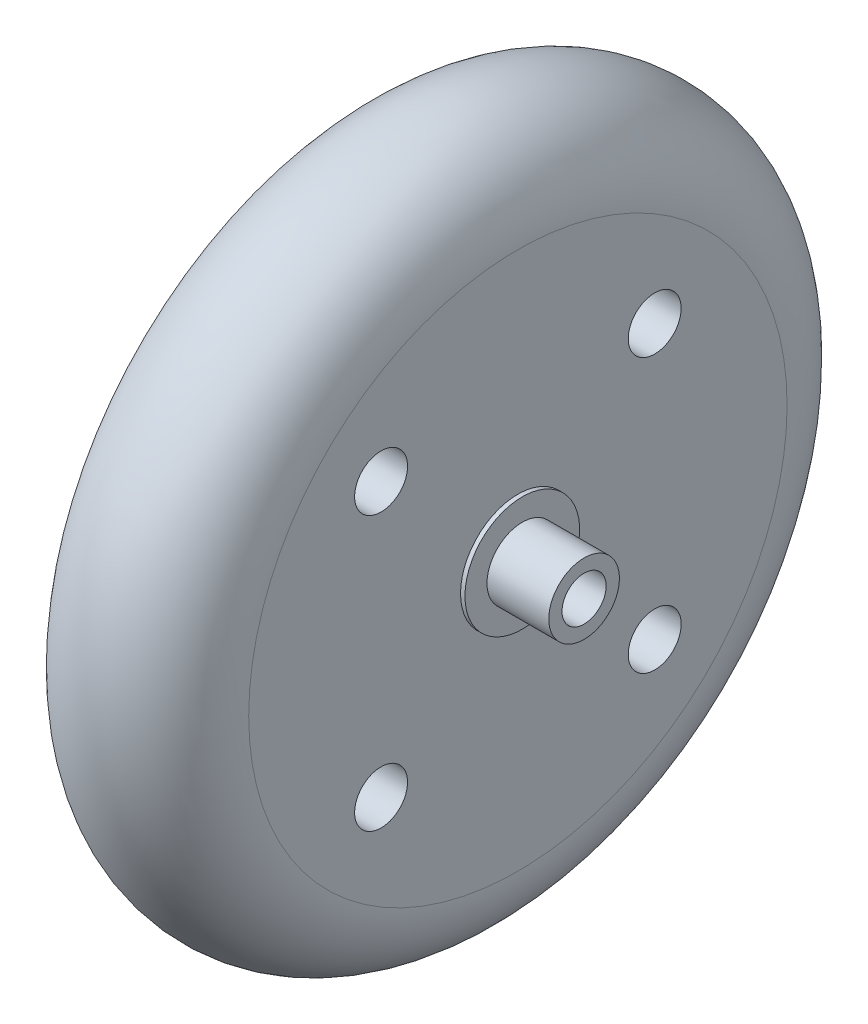
ISO-10303-21;
HEADER;
FILE_DESCRIPTION(('STEP AP214'),'2;1');
FILE_NAME('part.step','',(''),(''),'','','');
FILE_SCHEMA(('AUTOMOTIVE_DESIGN { 1 0 10303 214 1 1 1 1 }'));
ENDSEC;
DATA;
#1=APPLICATION_CONTEXT('core data for automotive mechanical design processes');
#2=APPLICATION_PROTOCOL_DEFINITION('international standard','automotive_design',2000,#1);
#3=PRODUCT_CONTEXT('',#1,'mechanical');
#4=PRODUCT('Part','Part','',(#3));
#5=PRODUCT_RELATED_PRODUCT_CATEGORY('part','',(#4));
#6=PRODUCT_DEFINITION_FORMATION('','',#4);
#7=PRODUCT_DEFINITION_CONTEXT('part definition',#1,'design');
#8=PRODUCT_DEFINITION('design','',#6,#7);
#9=PRODUCT_DEFINITION_SHAPE('','',#8);
#10=(LENGTH_UNIT() NAMED_UNIT(*) SI_UNIT(.MILLI.,.METRE.));
#11=(NAMED_UNIT(*) PLANE_ANGLE_UNIT() SI_UNIT($,.RADIAN.));
#12=(NAMED_UNIT(*) SI_UNIT($,.STERADIAN.) SOLID_ANGLE_UNIT());
#13=UNCERTAINTY_MEASURE_WITH_UNIT(LENGTH_MEASURE(1.E-05),#10,'distance_accuracy_value','');
#14=(GEOMETRIC_REPRESENTATION_CONTEXT(3) GLOBAL_UNCERTAINTY_ASSIGNED_CONTEXT((#13)) GLOBAL_UNIT_ASSIGNED_CONTEXT((#10,
#11,#12)) REPRESENTATION_CONTEXT('',''));
#15=CARTESIAN_POINT('',(0.,0.,0.));
#16=DIRECTION('',(0.,0.,1.));
#17=DIRECTION('',(1.,0.,0.));
#18=AXIS2_PLACEMENT_3D('',#15,#16,#17);
#19=CARTESIAN_POINT('',(10.,0.,0.));
#20=DIRECTION('',(-1.,0.,0.));
#21=DIRECTION('',(0.,0.,1.));
#22=AXIS2_PLACEMENT_3D('',#19,#20,#21);
#23=TOROIDAL_SURFACE('',#22,30.5,9.5);
#24=CARTESIAN_POINT('',(0.5,0.,0.));
#25=DIRECTION('',(-1.,0.,0.));
#26=DIRECTION('',(0.,0.,1.));
#27=AXIS2_PLACEMENT_3D('',#24,#25,#26);
#28=CIRCLE('',#27,30.5);
#29=CARTESIAN_POINT('',(0.5,0.,30.5));
#30=VERTEX_POINT('',#29);
#31=EDGE_CURVE('E10',#30,#30,#28,.T.);
#32=ORIENTED_EDGE('',*,*,#31,.F.);
#33=EDGE_LOOP('',(#32));
#34=FACE_BOUND('',#33,.T.);
#35=CARTESIAN_POINT('',(19.5,0.,0.));
#36=DIRECTION('',(-1.,0.,0.));
#37=DIRECTION('',(0.,0.,1.));
#38=AXIS2_PLACEMENT_3D('',#35,#36,#37);
#39=CIRCLE('',#38,30.5);
#40=CARTESIAN_POINT('',(19.5,0.,30.5));
#41=VERTEX_POINT('',#40);
#42=EDGE_CURVE('E72',#41,#41,#39,.T.);
#43=ORIENTED_EDGE('',*,*,#42,.T.);
#44=EDGE_LOOP('',(#43));
#45=FACE_BOUND('',#44,.T.);
#46=ADVANCED_FACE('F37',(#34,#45),#23,.T.);
#47=CARTESIAN_POINT('',(0.500000000000004,30.5,0.));
#48=DIRECTION('',(1.,0.,0.));
#49=DIRECTION('',(0.,0.,-1.));
#50=AXIS2_PLACEMENT_3D('',#47,#48,#49);
#51=PLANE('',#50);
#52=CARTESIAN_POINT('',(0.5,-15.5,15.5));
#53=DIRECTION('',(1.,0.,0.));
#54=DIRECTION('',(0.,0.,-1.));
#55=AXIS2_PLACEMENT_3D('',#52,#53,#54);
#56=CIRCLE('',#55,3.);
#57=CARTESIAN_POINT('',(0.5,-15.5,12.5));
#58=VERTEX_POINT('',#57);
#59=EDGE_CURVE('E89',#58,#58,#56,.T.);
#60=ORIENTED_EDGE('',*,*,#59,.T.);
#61=EDGE_LOOP('',(#60));
#62=FACE_BOUND('',#61,.T.);
#63=CARTESIAN_POINT('',(0.5,-15.5,-15.5));
#64=DIRECTION('',(1.,0.,0.));
#65=DIRECTION('',(0.,0.,-1.));
#66=AXIS2_PLACEMENT_3D('',#63,#64,#65);
#67=CIRCLE('',#66,3.);
#68=CARTESIAN_POINT('',(0.5,-15.5,-18.5));
#69=VERTEX_POINT('',#68);
#70=EDGE_CURVE('E97',#69,#69,#67,.T.);
#71=ORIENTED_EDGE('',*,*,#70,.T.);
#72=EDGE_LOOP('',(#71));
#73=FACE_BOUND('',#72,.T.);
#74=CARTESIAN_POINT('',(0.5,15.5,-15.5));
#75=DIRECTION('',(1.,0.,0.));
#76=DIRECTION('',(0.,0.,-1.));
#77=AXIS2_PLACEMENT_3D('',#74,#75,#76);
#78=CIRCLE('',#77,3.);
#79=CARTESIAN_POINT('',(0.5,15.5,-18.5));
#80=VERTEX_POINT('',#79);
#81=EDGE_CURVE('E81',#80,#80,#78,.T.);
#82=ORIENTED_EDGE('',*,*,#81,.T.);
#83=EDGE_LOOP('',(#82));
#84=FACE_BOUND('',#83,.T.);
#85=CARTESIAN_POINT('',(0.5,15.5,15.5));
#86=DIRECTION('',(1.,0.,0.));
#87=DIRECTION('',(0.,0.,-1.));
#88=AXIS2_PLACEMENT_3D('',#85,#86,#87);
#89=CIRCLE('',#88,3.);
#90=CARTESIAN_POINT('',(0.5,15.5,12.5));
#91=VERTEX_POINT('',#90);
#92=EDGE_CURVE('E76',#91,#91,#89,.T.);
#93=ORIENTED_EDGE('',*,*,#92,.T.);
#94=EDGE_LOOP('',(#93));
#95=FACE_BOUND('',#94,.T.);
#96=CARTESIAN_POINT('',(0.500000000000007,0.,0.));
#97=DIRECTION('',(-1.,0.,0.));
#98=DIRECTION('',(0.,0.,1.));
#99=AXIS2_PLACEMENT_3D('',#96,#97,#98);
#100=CIRCLE('',#99,2.50000000002728);
#101=CARTESIAN_POINT('',(0.500000000000007,0.,2.50000000002728));
#102=VERTEX_POINT('',#101);
#103=EDGE_CURVE('E44',#102,#102,#100,.T.);
#104=ORIENTED_EDGE('',*,*,#103,.F.);
#105=EDGE_LOOP('',(#104));
#106=FACE_BOUND('',#105,.T.);
#107=ORIENTED_EDGE('',*,*,#31,.T.);
#108=EDGE_LOOP('',(#107));
#109=FACE_BOUND('',#108,.T.);
#110=ADVANCED_FACE('F109',(#62,#73,#84,#95,#106,#109),#51,.F.);
#111=CARTESIAN_POINT('',(0.,0.,0.));
#112=DIRECTION('',(-1.,0.,0.));
#113=DIRECTION('',(0.,0.,1.));
#114=AXIS2_PLACEMENT_3D('',#111,#112,#113);
#115=CYLINDRICAL_SURFACE('',#114,2.50000000002728);
#116=CARTESIAN_POINT('',(27.,0.,0.));
#117=DIRECTION('',(-1.,0.,0.));
#118=DIRECTION('',(0.,0.,1.));
#119=AXIS2_PLACEMENT_3D('',#116,#117,#118);
#120=CIRCLE('',#119,2.50000000002728);
#121=CARTESIAN_POINT('',(27.,0.,2.50000000002728));
#122=VERTEX_POINT('',#121);
#123=EDGE_CURVE('E49',#122,#122,#120,.T.);
#124=ORIENTED_EDGE('',*,*,#123,.F.);
#125=EDGE_LOOP('',(#124));
#126=FACE_BOUND('',#125,.T.);
#127=ORIENTED_EDGE('',*,*,#103,.T.);
#128=EDGE_LOOP('',(#127));
#129=FACE_BOUND('',#128,.T.);
#130=ADVANCED_FACE('F152',(#126,#129),#115,.F.);
#131=CARTESIAN_POINT('',(27.,4.,0.));
#132=DIRECTION('',(-1.,0.,0.));
#133=DIRECTION('',(0.,0.,1.));
#134=AXIS2_PLACEMENT_3D('',#131,#132,#133);
#135=PLANE('',#134);
#136=CARTESIAN_POINT('',(27.,0.,0.));
#137=DIRECTION('',(-1.,0.,0.));
#138=DIRECTION('',(0.,0.,1.));
#139=AXIS2_PLACEMENT_3D('',#136,#137,#138);
#140=CIRCLE('',#139,4.);
#141=CARTESIAN_POINT('',(27.,0.,4.));
#142=VERTEX_POINT('',#141);
#143=EDGE_CURVE('E54',#142,#142,#140,.T.);
#144=ORIENTED_EDGE('',*,*,#143,.F.);
#145=EDGE_LOOP('',(#144));
#146=FACE_BOUND('',#145,.T.);
#147=ORIENTED_EDGE('',*,*,#123,.T.);
#148=EDGE_LOOP('',(#147));
#149=FACE_BOUND('',#148,.T.);
#150=ADVANCED_FACE('F146',(#146,#149),#135,.F.);
#151=CARTESIAN_POINT('',(0.,0.,0.));
#152=DIRECTION('',(-1.,0.,0.));
#153=DIRECTION('',(0.,0.,1.));
#154=AXIS2_PLACEMENT_3D('',#151,#152,#153);
#155=CYLINDRICAL_SURFACE('',#154,4.);
#156=CARTESIAN_POINT('',(20.,0.,0.));
#157=DIRECTION('',(-1.,0.,0.));
#158=DIRECTION('',(0.,0.,1.));
#159=AXIS2_PLACEMENT_3D('',#156,#157,#158);
#160=CIRCLE('',#159,4.);
#161=CARTESIAN_POINT('',(20.,0.,4.));
#162=VERTEX_POINT('',#161);
#163=EDGE_CURVE('E60',#162,#162,#160,.T.);
#164=ORIENTED_EDGE('',*,*,#163,.F.);
#165=EDGE_LOOP('',(#164));
#166=FACE_BOUND('',#165,.T.);
#167=ORIENTED_EDGE('',*,*,#143,.T.);
#168=EDGE_LOOP('',(#167));
#169=FACE_BOUND('',#168,.T.);
#170=ADVANCED_FACE('F140',(#166,#169),#155,.T.);
#171=CARTESIAN_POINT('',(20.,4.,0.));
#172=DIRECTION('',(-1.,0.,0.));
#173=DIRECTION('',(0.,0.,1.));
#174=AXIS2_PLACEMENT_3D('',#171,#172,#173);
#175=PLANE('',#174);
#176=CARTESIAN_POINT('',(20.,0.,0.));
#177=DIRECTION('',(-1.,0.,0.));
#178=DIRECTION('',(0.,0.,1.));
#179=AXIS2_PLACEMENT_3D('',#176,#177,#178);
#180=CIRCLE('',#179,6.5);
#181=CARTESIAN_POINT('',(20.,0.,6.5));
#182=VERTEX_POINT('',#181);
#183=EDGE_CURVE('E64',#182,#182,#180,.T.);
#184=ORIENTED_EDGE('',*,*,#183,.F.);
#185=EDGE_LOOP('',(#184));
#186=FACE_BOUND('',#185,.T.);
#187=ORIENTED_EDGE('',*,*,#163,.T.);
#188=EDGE_LOOP('',(#187));
#189=FACE_BOUND('',#188,.T.);
#190=ADVANCED_FACE('F134',(#186,#189),#175,.F.);
#191=CARTESIAN_POINT('',(0.,0.,0.));
#192=DIRECTION('',(-1.,0.,0.));
#193=DIRECTION('',(0.,0.,1.));
#194=AXIS2_PLACEMENT_3D('',#191,#192,#193);
#195=CYLINDRICAL_SURFACE('',#194,6.5);
#196=CARTESIAN_POINT('',(19.5,0.,0.));
#197=DIRECTION('',(-1.,0.,0.));
#198=DIRECTION('',(0.,0.,1.));
#199=AXIS2_PLACEMENT_3D('',#196,#197,#198);
#200=CIRCLE('',#199,6.5);
#201=CARTESIAN_POINT('',(19.5,0.,6.5));
#202=VERTEX_POINT('',#201);
#203=EDGE_CURVE('E68',#202,#202,#200,.T.);
#204=ORIENTED_EDGE('',*,*,#203,.F.);
#205=EDGE_LOOP('',(#204));
#206=FACE_BOUND('',#205,.T.);
#207=ORIENTED_EDGE('',*,*,#183,.T.);
#208=EDGE_LOOP('',(#207));
#209=FACE_BOUND('',#208,.T.);
#210=ADVANCED_FACE('F123',(#206,#209),#195,.T.);
#211=CARTESIAN_POINT('',(19.5,30.5,0.));
#212=DIRECTION('',(-1.,0.,0.));
#213=DIRECTION('',(0.,0.,1.));
#214=AXIS2_PLACEMENT_3D('',#211,#212,#213);
#215=PLANE('',#214);
#216=CARTESIAN_POINT('',(19.5,-15.5,15.5));
#217=DIRECTION('',(1.,0.,0.));
#218=DIRECTION('',(0.,0.,-1.));
#219=AXIS2_PLACEMENT_3D('',#216,#217,#218);
#220=CIRCLE('',#219,3.);
#221=CARTESIAN_POINT('',(19.5,-15.5,12.5));
#222=VERTEX_POINT('',#221);
#223=EDGE_CURVE('E85',#222,#222,#220,.T.);
#224=ORIENTED_EDGE('',*,*,#223,.F.);
#225=EDGE_LOOP('',(#224));
#226=FACE_BOUND('',#225,.T.);
#227=CARTESIAN_POINT('',(19.5,-15.5,-15.5));
#228=DIRECTION('',(1.,0.,0.));
#229=DIRECTION('',(0.,0.,-1.));
#230=AXIS2_PLACEMENT_3D('',#227,#228,#229);
#231=CIRCLE('',#230,3.);
#232=CARTESIAN_POINT('',(19.5,-15.5,-18.5));
#233=VERTEX_POINT('',#232);
#234=EDGE_CURVE('E93',#233,#233,#231,.T.);
#235=ORIENTED_EDGE('',*,*,#234,.F.);
#236=EDGE_LOOP('',(#235));
#237=FACE_BOUND('',#236,.T.);
#238=CARTESIAN_POINT('',(19.5,15.5,-15.5));
#239=DIRECTION('',(1.,0.,0.));
#240=DIRECTION('',(0.,0.,-1.));
#241=AXIS2_PLACEMENT_3D('',#238,#239,#240);
#242=CIRCLE('',#241,3.);
#243=CARTESIAN_POINT('',(19.5,15.5,-18.5));
#244=VERTEX_POINT('',#243);
#245=EDGE_CURVE('E101',#244,#244,#242,.T.);
#246=ORIENTED_EDGE('',*,*,#245,.F.);
#247=EDGE_LOOP('',(#246));
#248=FACE_BOUND('',#247,.T.);
#249=CARTESIAN_POINT('',(19.5,15.5,15.5));
#250=DIRECTION('',(1.,0.,0.));
#251=DIRECTION('',(0.,0.,-1.));
#252=AXIS2_PLACEMENT_3D('',#249,#250,#251);
#253=CIRCLE('',#252,3.);
#254=CARTESIAN_POINT('',(19.5,15.5,12.5));
#255=VERTEX_POINT('',#254);
#256=EDGE_CURVE('E77',#255,#255,#253,.T.);
#257=ORIENTED_EDGE('',*,*,#256,.F.);
#258=EDGE_LOOP('',(#257));
#259=FACE_BOUND('',#258,.T.);
#260=ORIENTED_EDGE('',*,*,#42,.F.);
#261=EDGE_LOOP('',(#260));
#262=FACE_BOUND('',#261,.T.);
#263=ORIENTED_EDGE('',*,*,#203,.T.);
#264=EDGE_LOOP('',(#263));
#265=FACE_BOUND('',#264,.T.);
#266=ADVANCED_FACE('F120',(#226,#237,#248,#259,#262,#265),#215,.F.);
#267=CARTESIAN_POINT('',(0.5,15.5,15.5));
#268=DIRECTION('',(1.,0.,0.));
#269=DIRECTION('',(0.,0.,-1.));
#270=AXIS2_PLACEMENT_3D('',#267,#268,#269);
#271=CYLINDRICAL_SURFACE('',#270,3.);
#272=ORIENTED_EDGE('',*,*,#92,.F.);
#273=EDGE_LOOP('',(#272));
#274=FACE_BOUND('',#273,.T.);
#275=ORIENTED_EDGE('',*,*,#256,.T.);
#276=EDGE_LOOP('',(#275));
#277=FACE_BOUND('',#276,.T.);
#278=ADVANCED_FACE('F116',(#274,#277),#271,.F.);
#279=CARTESIAN_POINT('',(0.5,15.5,-15.5));
#280=DIRECTION('',(1.,0.,0.));
#281=DIRECTION('',(0.,0.,-1.));
#282=AXIS2_PLACEMENT_3D('',#279,#280,#281);
#283=CYLINDRICAL_SURFACE('',#282,3.);
#284=ORIENTED_EDGE('',*,*,#81,.F.);
#285=EDGE_LOOP('',(#284));
#286=FACE_BOUND('',#285,.T.);
#287=ORIENTED_EDGE('',*,*,#245,.T.);
#288=EDGE_LOOP('',(#287));
#289=FACE_BOUND('',#288,.T.);
#290=ADVANCED_FACE('F112',(#286,#289),#283,.F.);
#291=CARTESIAN_POINT('',(0.5,-15.5,-15.5));
#292=DIRECTION('',(1.,0.,0.));
#293=DIRECTION('',(0.,0.,-1.));
#294=AXIS2_PLACEMENT_3D('',#291,#292,#293);
#295=CYLINDRICAL_SURFACE('',#294,3.);
#296=ORIENTED_EDGE('',*,*,#70,.F.);
#297=EDGE_LOOP('',(#296));
#298=FACE_BOUND('',#297,.T.);
#299=ORIENTED_EDGE('',*,*,#234,.T.);
#300=EDGE_LOOP('',(#299));
#301=FACE_BOUND('',#300,.T.);
#302=ADVANCED_FACE('F115',(#298,#301),#295,.F.);
#303=CARTESIAN_POINT('',(0.5,-15.5,15.5));
#304=DIRECTION('',(1.,0.,0.));
#305=DIRECTION('',(0.,0.,-1.));
#306=AXIS2_PLACEMENT_3D('',#303,#304,#305);
#307=CYLINDRICAL_SURFACE('',#306,3.);
#308=ORIENTED_EDGE('',*,*,#59,.F.);
#309=EDGE_LOOP('',(#308));
#310=FACE_BOUND('',#309,.T.);
#311=ORIENTED_EDGE('',*,*,#223,.T.);
#312=EDGE_LOOP('',(#311));
#313=FACE_BOUND('',#312,.T.);
#314=ADVANCED_FACE('F206',(#310,#313),#307,.F.);
#315=CLOSED_SHELL('',(#46,#110,#130,#150,#170,#190,#210,#266,#278,#290,#302,#314));
#316=MANIFOLD_SOLID_BREP('B2',#315);
#317=ADVANCED_BREP_SHAPE_REPRESENTATION('',(#18,#316),#14);
#318=SHAPE_DEFINITION_REPRESENTATION(#9,#317);
ENDSEC;
END-ISO-10303-21;
